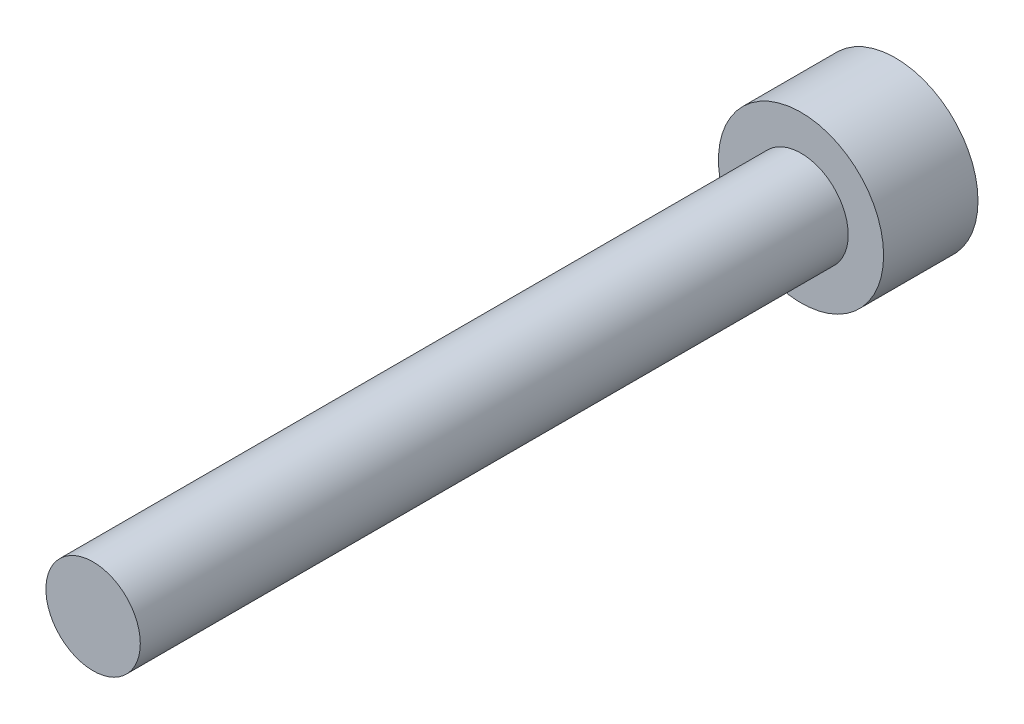
ISO-10303-21;
HEADER;
FILE_DESCRIPTION(('STEP AP214'),'2;1');
FILE_NAME('part.step','',(''),(''),'','','');
FILE_SCHEMA(('AUTOMOTIVE_DESIGN { 1 0 10303 214 1 1 1 1 }'));
ENDSEC;
DATA;
#1=APPLICATION_CONTEXT('core data for automotive mechanical design processes');
#2=APPLICATION_PROTOCOL_DEFINITION('international standard','automotive_design',2000,#1);
#3=PRODUCT_CONTEXT('',#1,'mechanical');
#4=PRODUCT('Part','Part','',(#3));
#5=PRODUCT_RELATED_PRODUCT_CATEGORY('part','',(#4));
#6=PRODUCT_DEFINITION_FORMATION('','',#4);
#7=PRODUCT_DEFINITION_CONTEXT('part definition',#1,'design');
#8=PRODUCT_DEFINITION('design','',#6,#7);
#9=PRODUCT_DEFINITION_SHAPE('','',#8);
#10=(LENGTH_UNIT() NAMED_UNIT(*) SI_UNIT(.MILLI.,.METRE.));
#11=(NAMED_UNIT(*) PLANE_ANGLE_UNIT() SI_UNIT($,.RADIAN.));
#12=(NAMED_UNIT(*) SI_UNIT($,.STERADIAN.) SOLID_ANGLE_UNIT());
#13=UNCERTAINTY_MEASURE_WITH_UNIT(LENGTH_MEASURE(1.E-05),#10,'distance_accuracy_value','');
#14=(GEOMETRIC_REPRESENTATION_CONTEXT(3) GLOBAL_UNCERTAINTY_ASSIGNED_CONTEXT((#13)) GLOBAL_UNIT_ASSIGNED_CONTEXT((#10,
#11,#12)) REPRESENTATION_CONTEXT('',''));
#15=CARTESIAN_POINT('',(0.,0.,0.));
#16=DIRECTION('',(0.,0.,1.));
#17=DIRECTION('',(1.,0.,0.));
#18=AXIS2_PLACEMENT_3D('',#15,#16,#17);
#19=CARTESIAN_POINT('',(0.,0.,4.));
#20=DIRECTION('',(0.,0.,-1.));
#21=DIRECTION('',(-1.,0.,0.));
#22=AXIS2_PLACEMENT_3D('',#19,#20,#21);
#23=CYLINDRICAL_SURFACE('',#22,3.5);
#24=CARTESIAN_POINT('',(0.,0.,4.));
#25=DIRECTION('',(0.,0.,1.));
#26=DIRECTION('',(1.,0.,0.));
#27=AXIS2_PLACEMENT_3D('',#24,#25,#26);
#28=CIRCLE('',#27,3.5);
#29=CARTESIAN_POINT('',(3.5,0.,4.));
#30=VERTEX_POINT('',#29);
#31=EDGE_CURVE('E40',#30,#30,#28,.T.);
#32=ORIENTED_EDGE('',*,*,#31,.F.);
#33=EDGE_LOOP('',(#32));
#34=FACE_BOUND('',#33,.T.);
#35=CARTESIAN_POINT('',(0.,0.,0.));
#36=DIRECTION('',(0.,0.,1.));
#37=DIRECTION('',(1.,0.,0.));
#38=AXIS2_PLACEMENT_3D('',#35,#36,#37);
#39=CIRCLE('',#38,3.5);
#40=CARTESIAN_POINT('',(3.5,0.,0.));
#41=VERTEX_POINT('',#40);
#42=EDGE_CURVE('E36',#41,#41,#39,.T.);
#43=ORIENTED_EDGE('',*,*,#42,.T.);
#44=EDGE_LOOP('',(#43));
#45=FACE_BOUND('',#44,.T.);
#46=ADVANCED_FACE('F33',(#34,#45),#23,.T.);
#47=CARTESIAN_POINT('',(0.,0.,4.));
#48=DIRECTION('',(0.,0.,1.));
#49=DIRECTION('',(1.,0.,0.));
#50=AXIS2_PLACEMENT_3D('',#47,#48,#49);
#51=PLANE('',#50);
#52=CARTESIAN_POINT('',(0.,0.,4.));
#53=DIRECTION('',(0.,0.,1.));
#54=DIRECTION('',(1.,0.,0.));
#55=AXIS2_PLACEMENT_3D('',#52,#53,#54);
#56=CIRCLE('',#55,2.);
#57=CARTESIAN_POINT('',(2.,0.,4.));
#58=VERTEX_POINT('',#57);
#59=EDGE_CURVE('E10',#58,#58,#56,.T.);
#60=ORIENTED_EDGE('',*,*,#59,.F.);
#61=EDGE_LOOP('',(#60));
#62=FACE_BOUND('',#61,.T.);
#63=ORIENTED_EDGE('',*,*,#31,.T.);
#64=EDGE_LOOP('',(#63));
#65=FACE_BOUND('',#64,.T.);
#66=ADVANCED_FACE('F57',(#62,#65),#51,.T.);
#67=CARTESIAN_POINT('',(0.,0.,0.));
#68=DIRECTION('',(0.,0.,1.));
#69=DIRECTION('',(1.,0.,0.));
#70=AXIS2_PLACEMENT_3D('',#67,#68,#69);
#71=PLANE('',#70);
#72=ORIENTED_EDGE('',*,*,#42,.F.);
#73=EDGE_LOOP('',(#72));
#74=FACE_BOUND('',#73,.T.);
#75=ADVANCED_FACE('F54',(#74),#71,.F.);
#76=CARTESIAN_POINT('',(0.,0.,34.));
#77=DIRECTION('',(0.,0.,-1.));
#78=DIRECTION('',(-1.,0.,0.));
#79=AXIS2_PLACEMENT_3D('',#76,#77,#78);
#80=CYLINDRICAL_SURFACE('',#79,2.);
#81=CARTESIAN_POINT('',(0.,0.,34.));
#82=DIRECTION('',(0.,0.,1.));
#83=DIRECTION('',(1.,0.,0.));
#84=AXIS2_PLACEMENT_3D('',#81,#82,#83);
#85=CIRCLE('',#84,2.);
#86=CARTESIAN_POINT('',(2.,0.,34.));
#87=VERTEX_POINT('',#86);
#88=EDGE_CURVE('E46',#87,#87,#85,.T.);
#89=ORIENTED_EDGE('',*,*,#88,.F.);
#90=EDGE_LOOP('',(#89));
#91=FACE_BOUND('',#90,.T.);
#92=ORIENTED_EDGE('',*,*,#59,.T.);
#93=EDGE_LOOP('',(#92));
#94=FACE_BOUND('',#93,.T.);
#95=ADVANCED_FACE('F56',(#91,#94),#80,.T.);
#96=CARTESIAN_POINT('',(0.,0.,34.));
#97=DIRECTION('',(0.,0.,1.));
#98=DIRECTION('',(1.,0.,0.));
#99=AXIS2_PLACEMENT_3D('',#96,#97,#98);
#100=PLANE('',#99);
#101=ORIENTED_EDGE('',*,*,#88,.T.);
#102=EDGE_LOOP('',(#101));
#103=FACE_BOUND('',#102,.T.);
#104=ADVANCED_FACE('F62',(#103),#100,.T.);
#105=CLOSED_SHELL('',(#46,#66,#75,#95,#104));
#106=MANIFOLD_SOLID_BREP('B2',#105);
#107=ADVANCED_BREP_SHAPE_REPRESENTATION('',(#18,#106),#14);
#108=SHAPE_DEFINITION_REPRESENTATION(#9,#107);
ENDSEC;
END-ISO-10303-21;
